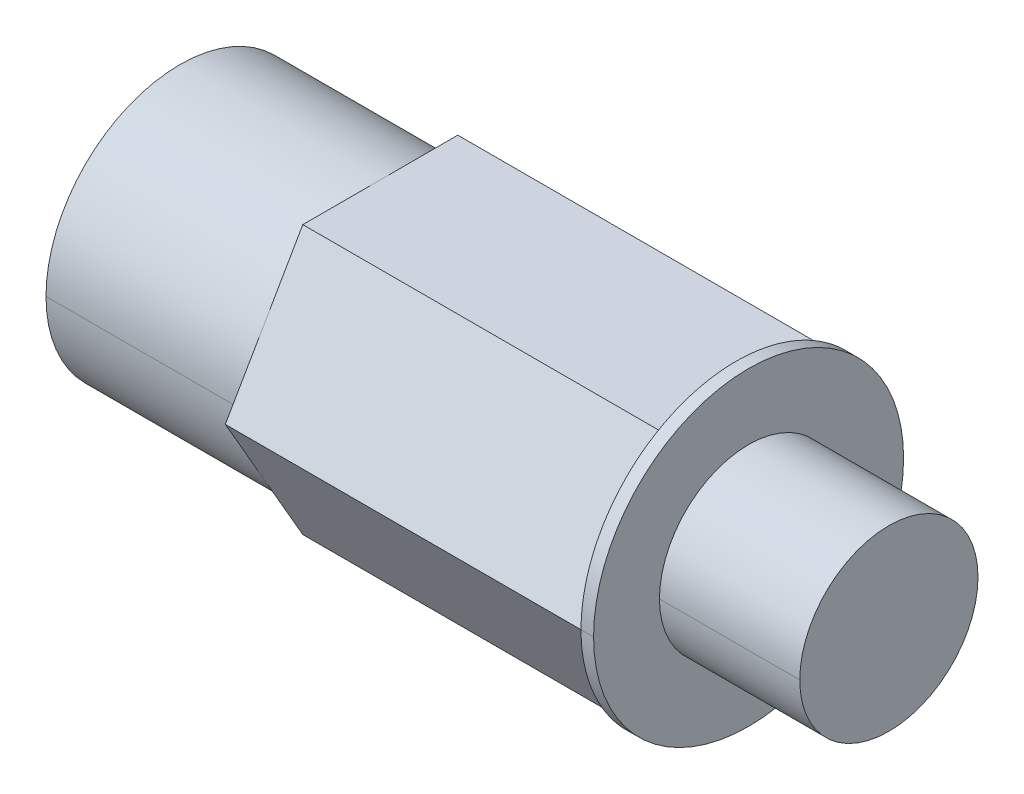
ISO-10303-21;
HEADER;
FILE_DESCRIPTION(('STEP AP214'),'2;1');
FILE_NAME('part.step','',(''),(''),'','','');
FILE_SCHEMA(('AUTOMOTIVE_DESIGN { 1 0 10303 214 1 1 1 1 }'));
ENDSEC;
DATA;
#1=APPLICATION_CONTEXT('core data for automotive mechanical design processes');
#2=APPLICATION_PROTOCOL_DEFINITION('international standard','automotive_design',2000,#1);
#3=PRODUCT_CONTEXT('',#1,'mechanical');
#4=PRODUCT('Part','Part','',(#3));
#5=PRODUCT_RELATED_PRODUCT_CATEGORY('part','',(#4));
#6=PRODUCT_DEFINITION_FORMATION('','',#4);
#7=PRODUCT_DEFINITION_CONTEXT('part definition',#1,'design');
#8=PRODUCT_DEFINITION('design','',#6,#7);
#9=PRODUCT_DEFINITION_SHAPE('','',#8);
#10=(LENGTH_UNIT() NAMED_UNIT(*) SI_UNIT(.MILLI.,.METRE.));
#11=(NAMED_UNIT(*) PLANE_ANGLE_UNIT() SI_UNIT($,.RADIAN.));
#12=(NAMED_UNIT(*) SI_UNIT($,.STERADIAN.) SOLID_ANGLE_UNIT());
#13=UNCERTAINTY_MEASURE_WITH_UNIT(LENGTH_MEASURE(1.E-05),#10,'distance_accuracy_value','');
#14=(GEOMETRIC_REPRESENTATION_CONTEXT(3) GLOBAL_UNCERTAINTY_ASSIGNED_CONTEXT((#13)) GLOBAL_UNIT_ASSIGNED_CONTEXT((#10,
#11,#12)) REPRESENTATION_CONTEXT('',''));
#15=CARTESIAN_POINT('',(0.,0.,0.));
#16=DIRECTION('',(0.,0.,1.));
#17=DIRECTION('',(1.,0.,0.));
#18=AXIS2_PLACEMENT_3D('',#15,#16,#17);
#19=CARTESIAN_POINT('',(11.7348,0.,0.));
#20=DIRECTION('',(1.,0.,0.));
#21=DIRECTION('',(0.,1.,0.));
#22=AXIS2_PLACEMENT_3D('',#19,#20,#21);
#23=PLANE('',#22);
#24=CARTESIAN_POINT('',(11.7348,0.,0.));
#25=DIRECTION('',(1.,0.,0.));
#26=DIRECTION('',(0.,0.,-1.));
#27=AXIS2_PLACEMENT_3D('',#24,#25,#26);
#28=CIRCLE('',#27,3.1623);
#29=CARTESIAN_POINT('',(11.7348,0.,3.1623));
#30=VERTEX_POINT('',#29);
#31=CARTESIAN_POINT('',(11.7348,0.,-3.1623));
#32=VERTEX_POINT('',#31);
#33=EDGE_CURVE('E11',#30,#32,#28,.T.);
#34=ORIENTED_EDGE('',*,*,#33,.T.);
#35=CARTESIAN_POINT('',(11.7348,0.,0.));
#36=DIRECTION('',(1.,0.,0.));
#37=DIRECTION('',(0.,0.,-1.));
#38=AXIS2_PLACEMENT_3D('',#35,#36,#37);
#39=CIRCLE('',#38,3.1623);
#40=EDGE_CURVE('E273',#32,#30,#39,.T.);
#41=ORIENTED_EDGE('',*,*,#40,.T.);
#42=EDGE_LOOP('',(#34,#41));
#43=FACE_BOUND('',#42,.T.);
#44=ADVANCED_FACE('F16',(#43),#23,.T.);
#45=CARTESIAN_POINT('',(11.7348,0.,0.));
#46=DIRECTION('',(-1.,0.,0.));
#47=DIRECTION('',(0.,0.,1.));
#48=AXIS2_PLACEMENT_3D('',#45,#46,#47);
#49=CYLINDRICAL_SURFACE('',#48,3.1623);
#50=DIRECTION('',(-1.,0.,0.));
#51=VECTOR('',#50,1.);
#52=CARTESIAN_POINT('',(11.7348,0.,-3.1623));
#53=LINE('',#52,#51);
#54=CARTESIAN_POINT('',(6.7564,0.,-3.1623));
#55=VERTEX_POINT('',#54);
#56=EDGE_CURVE('E270',#32,#55,#53,.T.);
#57=ORIENTED_EDGE('',*,*,#56,.F.);
#58=ORIENTED_EDGE('',*,*,#33,.F.);
#59=DIRECTION('',(-1.,0.,0.));
#60=VECTOR('',#59,1.);
#61=CARTESIAN_POINT('',(11.7348,0.,3.1623));
#62=LINE('',#61,#60);
#63=CARTESIAN_POINT('',(6.7564,0.,3.1623));
#64=VERTEX_POINT('',#63);
#65=EDGE_CURVE('E188',#30,#64,#62,.T.);
#66=ORIENTED_EDGE('',*,*,#65,.T.);
#67=CARTESIAN_POINT('',(6.7564,0.,0.));
#68=DIRECTION('',(1.,0.,0.));
#69=DIRECTION('',(0.,0.,-1.));
#70=AXIS2_PLACEMENT_3D('',#67,#68,#69);
#71=CIRCLE('',#70,3.1623);
#72=EDGE_CURVE('E27',#64,#55,#71,.T.);
#73=ORIENTED_EDGE('',*,*,#72,.T.);
#74=EDGE_LOOP('',(#57,#58,#66,#73));
#75=FACE_BOUND('',#74,.T.);
#76=ADVANCED_FACE('F339',(#75),#49,.T.);
#77=CARTESIAN_POINT('',(6.7564,0.,0.));
#78=DIRECTION('',(1.,0.,0.));
#79=DIRECTION('',(0.,1.,0.));
#80=AXIS2_PLACEMENT_3D('',#77,#78,#79);
#81=PLANE('',#80);
#82=ORIENTED_EDGE('',*,*,#72,.F.);
#83=CARTESIAN_POINT('',(6.7564,0.,0.));
#84=DIRECTION('',(1.,0.,0.));
#85=DIRECTION('',(0.,0.,-1.));
#86=AXIS2_PLACEMENT_3D('',#83,#84,#85);
#87=CIRCLE('',#86,3.1623);
#88=EDGE_CURVE('E196',#55,#64,#87,.T.);
#89=ORIENTED_EDGE('',*,*,#88,.F.);
#90=EDGE_LOOP('',(#82,#89));
#91=FACE_BOUND('',#90,.T.);
#92=CARTESIAN_POINT('',(6.7564,0.,0.));
#93=DIRECTION('',(1.,0.,0.));
#94=DIRECTION('',(0.,0.,-1.));
#95=AXIS2_PLACEMENT_3D('',#92,#93,#94);
#96=CIRCLE('',#95,5.5);
#97=CARTESIAN_POINT('',(6.7564,0.,5.5));
#98=VERTEX_POINT('',#97);
#99=CARTESIAN_POINT('',(6.7564,0.,-5.5));
#100=VERTEX_POINT('',#99);
#101=EDGE_CURVE('E167',#98,#100,#96,.T.);
#102=ORIENTED_EDGE('',*,*,#101,.T.);
#103=CARTESIAN_POINT('',(6.7564,0.,0.));
#104=DIRECTION('',(1.,0.,0.));
#105=DIRECTION('',(0.,0.,-1.));
#106=AXIS2_PLACEMENT_3D('',#103,#104,#105);
#107=CIRCLE('',#106,5.5);
#108=EDGE_CURVE('E181',#100,#98,#107,.T.);
#109=ORIENTED_EDGE('',*,*,#108,.T.);
#110=EDGE_LOOP('',(#102,#109));
#111=FACE_BOUND('',#110,.T.);
#112=ADVANCED_FACE('F186',(#91,#111),#81,.T.);
#113=CARTESIAN_POINT('',(6.7564,0.,0.));
#114=DIRECTION('',(-1.,0.,0.));
#115=DIRECTION('',(0.,0.,1.));
#116=AXIS2_PLACEMENT_3D('',#113,#114,#115);
#117=CYLINDRICAL_SURFACE('',#116,5.5);
#118=DIRECTION('',(-1.,0.,0.));
#119=VECTOR('',#118,1.);
#120=CARTESIAN_POINT('',(6.7564,0.,-5.5));
#121=LINE('',#120,#119);
#122=CARTESIAN_POINT('',(6.3119,0.,-5.5));
#123=VERTEX_POINT('',#122);
#124=EDGE_CURVE('E173',#100,#123,#121,.T.);
#125=ORIENTED_EDGE('',*,*,#124,.F.);
#126=ORIENTED_EDGE('',*,*,#101,.F.);
#127=DIRECTION('',(-1.,0.,0.));
#128=VECTOR('',#127,1.);
#129=CARTESIAN_POINT('',(6.7564,0.,5.5));
#130=LINE('',#129,#128);
#131=CARTESIAN_POINT('',(6.3119,0.,5.5));
#132=VERTEX_POINT('',#131);
#133=EDGE_CURVE('E170',#98,#132,#130,.T.);
#134=ORIENTED_EDGE('',*,*,#133,.T.);
#135=CARTESIAN_POINT('',(6.3119,0.,0.));
#136=DIRECTION('',(1.,0.,0.));
#137=DIRECTION('',(0.,0.,-1.));
#138=AXIS2_PLACEMENT_3D('',#135,#136,#137);
#139=CIRCLE('',#138,5.5);
#140=EDGE_CURVE('E162',#132,#123,#139,.T.);
#141=ORIENTED_EDGE('',*,*,#140,.T.);
#142=EDGE_LOOP('',(#125,#126,#134,#141));
#143=FACE_BOUND('',#142,.T.);
#144=ADVANCED_FACE('F169',(#143),#117,.T.);
#145=CARTESIAN_POINT('',(6.3119,0.,0.));
#146=DIRECTION('',(1.,0.,0.));
#147=DIRECTION('',(0.,1.,0.));
#148=AXIS2_PLACEMENT_3D('',#145,#146,#147);
#149=PLANE('',#148);
#150=DIRECTION('',(0.,0.,-1.));
#151=VECTOR('',#150,1.);
#152=CARTESIAN_POINT('',(6.3119,-4.7625,2.74963065701558));
#153=LINE('',#152,#151);
#154=CARTESIAN_POINT('',(6.3119,-4.7625,2.74963065701558));
#155=VERTEX_POINT('',#154);
#156=CARTESIAN_POINT('',(6.3119,-4.7625,-2.7496306570156));
#157=VERTEX_POINT('',#156);
#158=EDGE_CURVE('E42',#155,#157,#153,.T.);
#159=ORIENTED_EDGE('',*,*,#158,.T.);
#160=DIRECTION('',(0.,0.866025403784439,-0.5));
#161=VECTOR('',#160,1.);
#162=CARTESIAN_POINT('',(6.3119,-4.7625,-2.7496306570156));
#163=LINE('',#162,#161);
#164=CARTESIAN_POINT('',(6.3119,0.,-5.49926131403118));
#165=VERTEX_POINT('',#164);
#166=EDGE_CURVE('E206',#157,#165,#163,.T.);
#167=ORIENTED_EDGE('',*,*,#166,.T.);
#168=DIRECTION('',(0.,0.866025403784439,0.5));
#169=VECTOR('',#168,1.);
#170=CARTESIAN_POINT('',(6.3119,0.,-5.49926131403118));
#171=LINE('',#170,#169);
#172=CARTESIAN_POINT('',(6.3119,4.7625,-2.74963065701559));
#173=VERTEX_POINT('',#172);
#174=EDGE_CURVE('E108',#165,#173,#171,.T.);
#175=ORIENTED_EDGE('',*,*,#174,.T.);
#176=DIRECTION('',(0.,0.,1.));
#177=VECTOR('',#176,1.);
#178=CARTESIAN_POINT('',(6.3119,4.7625,-2.74963065701559));
#179=LINE('',#178,#177);
#180=CARTESIAN_POINT('',(6.3119,4.7625,2.74963065701559));
#181=VERTEX_POINT('',#180);
#182=EDGE_CURVE('E242',#173,#181,#179,.T.);
#183=ORIENTED_EDGE('',*,*,#182,.T.);
#184=DIRECTION('',(0.,-0.866025403784439,0.5));
#185=VECTOR('',#184,1.);
#186=CARTESIAN_POINT('',(6.3119,4.7625,2.74963065701559));
#187=LINE('',#186,#185);
#188=CARTESIAN_POINT('',(6.3119,0.,5.49926131403118));
#189=VERTEX_POINT('',#188);
#190=EDGE_CURVE('E266',#181,#189,#187,.T.);
#191=ORIENTED_EDGE('',*,*,#190,.T.);
#192=DIRECTION('',(0.,-0.866025403784438,-0.5));
#193=VECTOR('',#192,1.);
#194=CARTESIAN_POINT('',(6.3119,0.,5.49926131403118));
#195=LINE('',#194,#193);
#196=EDGE_CURVE('E223',#189,#155,#195,.T.);
#197=ORIENTED_EDGE('',*,*,#196,.T.);
#198=EDGE_LOOP('',(#159,#167,#175,#183,#191,#197));
#199=FACE_BOUND('',#198,.T.);
#200=ORIENTED_EDGE('',*,*,#140,.F.);
#201=CARTESIAN_POINT('',(6.3119,0.,0.));
#202=DIRECTION('',(1.,0.,0.));
#203=DIRECTION('',(0.,0.,-1.));
#204=AXIS2_PLACEMENT_3D('',#201,#202,#203);
#205=CIRCLE('',#204,5.5);
#206=EDGE_CURVE('E182',#123,#132,#205,.T.);
#207=ORIENTED_EDGE('',*,*,#206,.F.);
#208=EDGE_LOOP('',(#200,#207));
#209=FACE_BOUND('',#208,.T.);
#210=ADVANCED_FACE('F345',(#199,#209),#149,.F.);
#211=CARTESIAN_POINT('',(-13.4239,0.,0.));
#212=DIRECTION('',(-1.,0.,0.));
#213=DIRECTION('',(0.,0.,1.));
#214=AXIS2_PLACEMENT_3D('',#211,#212,#213);
#215=PLANE('',#214);
#216=CARTESIAN_POINT('',(-13.4239,0.,0.));
#217=DIRECTION('',(-1.,0.,0.));
#218=DIRECTION('',(0.,0.,1.));
#219=AXIS2_PLACEMENT_3D('',#216,#217,#218);
#220=CIRCLE('',#219,4.7498);
#221=CARTESIAN_POINT('',(-13.4239,0.,-4.7498));
#222=VERTEX_POINT('',#221);
#223=CARTESIAN_POINT('',(-13.4239,0.,4.7498));
#224=VERTEX_POINT('',#223);
#225=EDGE_CURVE('E142',#222,#224,#220,.T.);
#226=ORIENTED_EDGE('',*,*,#225,.T.);
#227=CARTESIAN_POINT('',(-13.4239,0.,0.));
#228=DIRECTION('',(-1.,0.,0.));
#229=DIRECTION('',(0.,0.,1.));
#230=AXIS2_PLACEMENT_3D('',#227,#228,#229);
#231=CIRCLE('',#230,4.7498);
#232=EDGE_CURVE('E184',#224,#222,#231,.T.);
#233=ORIENTED_EDGE('',*,*,#232,.T.);
#234=EDGE_LOOP('',(#226,#233));
#235=FACE_BOUND('',#234,.T.);
#236=ADVANCED_FACE('F348',(#235),#215,.T.);
#237=CARTESIAN_POINT('',(-13.4239,0.,0.));
#238=DIRECTION('',(1.,0.,0.));
#239=DIRECTION('',(0.,0.,-1.));
#240=AXIS2_PLACEMENT_3D('',#237,#238,#239);
#241=CYLINDRICAL_SURFACE('',#240,4.7498);
#242=DIRECTION('',(1.,0.,0.));
#243=VECTOR('',#242,1.);
#244=CARTESIAN_POINT('',(-13.4239,0.,4.7498));
#245=LINE('',#244,#243);
#246=CARTESIAN_POINT('',(-6.3119,0.,4.7498));
#247=VERTEX_POINT('',#246);
#248=EDGE_CURVE('E202',#224,#247,#245,.T.);
#249=ORIENTED_EDGE('',*,*,#248,.F.);
#250=ORIENTED_EDGE('',*,*,#225,.F.);
#251=DIRECTION('',(1.,0.,0.));
#252=VECTOR('',#251,1.);
#253=CARTESIAN_POINT('',(-13.4239,0.,-4.7498));
#254=LINE('',#253,#252);
#255=CARTESIAN_POINT('',(-6.3119,0.,-4.7498));
#256=VERTEX_POINT('',#255);
#257=EDGE_CURVE('E257',#222,#256,#254,.T.);
#258=ORIENTED_EDGE('',*,*,#257,.T.);
#259=CARTESIAN_POINT('',(-6.3119,0.,0.));
#260=DIRECTION('',(-1.,0.,0.));
#261=DIRECTION('',(0.,0.,1.));
#262=AXIS2_PLACEMENT_3D('',#259,#260,#261);
#263=CIRCLE('',#262,4.7498);
#264=EDGE_CURVE('E212',#256,#247,#263,.T.);
#265=ORIENTED_EDGE('',*,*,#264,.T.);
#266=EDGE_LOOP('',(#249,#250,#258,#265));
#267=FACE_BOUND('',#266,.T.);
#268=ADVANCED_FACE('F334',(#267),#241,.T.);
#269=CARTESIAN_POINT('',(-6.3119,0.,0.));
#270=DIRECTION('',(1.,0.,0.));
#271=DIRECTION('',(0.,1.,0.));
#272=AXIS2_PLACEMENT_3D('',#269,#270,#271);
#273=PLANE('',#272);
#274=ORIENTED_EDGE('',*,*,#264,.F.);
#275=CARTESIAN_POINT('',(-6.3119,0.,0.));
#276=DIRECTION('',(-1.,0.,0.));
#277=DIRECTION('',(0.,0.,1.));
#278=AXIS2_PLACEMENT_3D('',#275,#276,#277);
#279=CIRCLE('',#278,4.7498);
#280=EDGE_CURVE('E267',#247,#256,#279,.T.);
#281=ORIENTED_EDGE('',*,*,#280,.F.);
#282=EDGE_LOOP('',(#274,#281));
#283=FACE_BOUND('',#282,.T.);
#284=DIRECTION('',(0.,0.866025403784439,-0.5));
#285=VECTOR('',#284,1.);
#286=CARTESIAN_POINT('',(-6.3119,-4.7625,-2.7496306570156));
#287=LINE('',#286,#285);
#288=CARTESIAN_POINT('',(-6.3119,-4.7625,-2.7496306570156));
#289=VERTEX_POINT('',#288);
#290=CARTESIAN_POINT('',(-6.3119,0.,-5.49926131403118));
#291=VERTEX_POINT('',#290);
#292=EDGE_CURVE('E207',#289,#291,#287,.T.);
#293=ORIENTED_EDGE('',*,*,#292,.F.);
#294=DIRECTION('',(0.,0.,-1.));
#295=VECTOR('',#294,1.);
#296=CARTESIAN_POINT('',(-6.3119,-4.7625,2.74963065701558));
#297=LINE('',#296,#295);
#298=CARTESIAN_POINT('',(-6.3119,-4.7625,2.74963065701558));
#299=VERTEX_POINT('',#298);
#300=EDGE_CURVE('E218',#299,#289,#297,.T.);
#301=ORIENTED_EDGE('',*,*,#300,.F.);
#302=DIRECTION('',(0.,-0.866025403784438,-0.5));
#303=VECTOR('',#302,1.);
#304=CARTESIAN_POINT('',(-6.3119,0.,5.49926131403118));
#305=LINE('',#304,#303);
#306=CARTESIAN_POINT('',(-6.3119,0.,5.49926131403118));
#307=VERTEX_POINT('',#306);
#308=EDGE_CURVE('E236',#307,#299,#305,.T.);
#309=ORIENTED_EDGE('',*,*,#308,.F.);
#310=DIRECTION('',(0.,-0.866025403784439,0.5));
#311=VECTOR('',#310,1.);
#312=CARTESIAN_POINT('',(-6.3119,4.7625,2.74963065701559));
#313=LINE('',#312,#311);
#314=CARTESIAN_POINT('',(-6.3119,4.7625,2.74963065701559));
#315=VERTEX_POINT('',#314);
#316=EDGE_CURVE('E246',#315,#307,#313,.T.);
#317=ORIENTED_EDGE('',*,*,#316,.F.);
#318=DIRECTION('',(0.,0.,1.));
#319=VECTOR('',#318,1.);
#320=CARTESIAN_POINT('',(-6.3119,4.7625,-2.74963065701559));
#321=LINE('',#320,#319);
#322=CARTESIAN_POINT('',(-6.3119,4.7625,-2.74963065701559));
#323=VERTEX_POINT('',#322);
#324=EDGE_CURVE('E20',#323,#315,#321,.T.);
#325=ORIENTED_EDGE('',*,*,#324,.F.);
#326=DIRECTION('',(0.,0.866025403784439,0.5));
#327=VECTOR('',#326,1.);
#328=CARTESIAN_POINT('',(-6.3119,0.,-5.49926131403118));
#329=LINE('',#328,#327);
#330=EDGE_CURVE('E228',#291,#323,#329,.T.);
#331=ORIENTED_EDGE('',*,*,#330,.F.);
#332=EDGE_LOOP('',(#293,#301,#309,#317,#325,#331));
#333=FACE_BOUND('',#332,.T.);
#334=ADVANCED_FACE('F323',(#283,#333),#273,.F.);
#335=CARTESIAN_POINT('',(6.3119,-4.7625,2.74963065701558));
#336=DIRECTION('',(0.,1.,0.));
#337=DIRECTION('',(0.,0.,-1.));
#338=AXIS2_PLACEMENT_3D('',#335,#336,#337);
#339=PLANE('',#338);
#340=ORIENTED_EDGE('',*,*,#300,.T.);
#341=DIRECTION('',(-1.,0.,0.));
#342=VECTOR('',#341,1.);
#343=CARTESIAN_POINT('',(6.3119,-4.7625,-2.7496306570156));
#344=LINE('',#343,#342);
#345=EDGE_CURVE('E210',#157,#289,#344,.T.);
#346=ORIENTED_EDGE('',*,*,#345,.F.);
#347=ORIENTED_EDGE('',*,*,#158,.F.);
#348=DIRECTION('',(-1.,0.,0.));
#349=VECTOR('',#348,1.);
#350=CARTESIAN_POINT('',(6.3119,-4.7625,2.74963065701558));
#351=LINE('',#350,#349);
#352=EDGE_CURVE('E233',#155,#299,#351,.T.);
#353=ORIENTED_EDGE('',*,*,#352,.T.);
#354=EDGE_LOOP('',(#340,#346,#347,#353));
#355=FACE_BOUND('',#354,.T.);
#356=ADVANCED_FACE('F324',(#355),#339,.F.);
#357=CARTESIAN_POINT('',(6.3119,0.,5.49926131403118));
#358=DIRECTION('',(0.,0.5,-0.866025403784438));
#359=DIRECTION('',(-1.,0.,0.));
#360=AXIS2_PLACEMENT_3D('',#357,#358,#359);
#361=PLANE('',#360);
#362=ORIENTED_EDGE('',*,*,#308,.T.);
#363=ORIENTED_EDGE('',*,*,#352,.F.);
#364=ORIENTED_EDGE('',*,*,#196,.F.);
#365=DIRECTION('',(-1.,0.,0.));
#366=VECTOR('',#365,1.);
#367=CARTESIAN_POINT('',(6.3119,0.,5.49926131403118));
#368=LINE('',#367,#366);
#369=EDGE_CURVE('E250',#189,#307,#368,.T.);
#370=ORIENTED_EDGE('',*,*,#369,.T.);
#371=EDGE_LOOP('',(#362,#363,#364,#370));
#372=FACE_BOUND('',#371,.T.);
#373=ADVANCED_FACE('F318',(#372),#361,.F.);
#374=CARTESIAN_POINT('',(6.3119,4.7625,2.74963065701559));
#375=DIRECTION('',(0.,-0.5,-0.866025403784439));
#376=DIRECTION('',(0.,-0.866025403784439,0.5));
#377=AXIS2_PLACEMENT_3D('',#374,#375,#376);
#378=PLANE('',#377);
#379=ORIENTED_EDGE('',*,*,#316,.T.);
#380=ORIENTED_EDGE('',*,*,#369,.F.);
#381=ORIENTED_EDGE('',*,*,#190,.F.);
#382=DIRECTION('',(-1.,0.,0.));
#383=VECTOR('',#382,1.);
#384=CARTESIAN_POINT('',(6.3119,4.7625,2.74963065701559));
#385=LINE('',#384,#383);
#386=EDGE_CURVE('E247',#181,#315,#385,.T.);
#387=ORIENTED_EDGE('',*,*,#386,.T.);
#388=EDGE_LOOP('',(#379,#380,#381,#387));
#389=FACE_BOUND('',#388,.T.);
#390=ADVANCED_FACE('F332',(#389),#378,.F.);
#391=CARTESIAN_POINT('',(6.3119,4.7625,-2.74963065701559));
#392=DIRECTION('',(0.,-1.,0.));
#393=DIRECTION('',(0.,0.,-1.));
#394=AXIS2_PLACEMENT_3D('',#391,#392,#393);
#395=PLANE('',#394);
#396=ORIENTED_EDGE('',*,*,#324,.T.);
#397=ORIENTED_EDGE('',*,*,#386,.F.);
#398=ORIENTED_EDGE('',*,*,#182,.F.);
#399=DIRECTION('',(-1.,0.,0.));
#400=VECTOR('',#399,1.);
#401=CARTESIAN_POINT('',(6.3119,4.7625,-2.74963065701559));
#402=LINE('',#401,#400);
#403=EDGE_CURVE('E232',#173,#323,#402,.T.);
#404=ORIENTED_EDGE('',*,*,#403,.T.);
#405=EDGE_LOOP('',(#396,#397,#398,#404));
#406=FACE_BOUND('',#405,.T.);
#407=ADVANCED_FACE('F18',(#406),#395,.F.);
#408=CARTESIAN_POINT('',(6.3119,0.,-5.49926131403118));
#409=DIRECTION('',(0.,-0.5,0.866025403784439));
#410=DIRECTION('',(-1.,0.,0.));
#411=AXIS2_PLACEMENT_3D('',#408,#409,#410);
#412=PLANE('',#411);
#413=ORIENTED_EDGE('',*,*,#330,.T.);
#414=ORIENTED_EDGE('',*,*,#403,.F.);
#415=ORIENTED_EDGE('',*,*,#174,.F.);
#416=DIRECTION('',(-1.,0.,0.));
#417=VECTOR('',#416,1.);
#418=CARTESIAN_POINT('',(6.3119,0.,-5.49926131403118));
#419=LINE('',#418,#417);
#420=EDGE_CURVE('E203',#165,#291,#419,.T.);
#421=ORIENTED_EDGE('',*,*,#420,.T.);
#422=EDGE_LOOP('',(#413,#414,#415,#421));
#423=FACE_BOUND('',#422,.T.);
#424=ADVANCED_FACE('F349',(#423),#412,.F.);
#425=CARTESIAN_POINT('',(6.3119,-4.7625,-2.7496306570156));
#426=DIRECTION('',(0.,0.5,0.866025403784439));
#427=DIRECTION('',(1.,0.,0.));
#428=AXIS2_PLACEMENT_3D('',#425,#426,#427);
#429=PLANE('',#428);
#430=ORIENTED_EDGE('',*,*,#292,.T.);
#431=ORIENTED_EDGE('',*,*,#420,.F.);
#432=ORIENTED_EDGE('',*,*,#166,.F.);
#433=ORIENTED_EDGE('',*,*,#345,.T.);
#434=EDGE_LOOP('',(#430,#431,#432,#433));
#435=FACE_BOUND('',#434,.T.);
#436=ADVANCED_FACE('F351',(#435),#429,.F.);
#437=CARTESIAN_POINT('',(-13.4239,0.,0.));
#438=DIRECTION('',(1.,0.,0.));
#439=DIRECTION('',(0.,0.,-1.));
#440=AXIS2_PLACEMENT_3D('',#437,#438,#439);
#441=CYLINDRICAL_SURFACE('',#440,4.7498);
#442=ORIENTED_EDGE('',*,*,#232,.F.);
#443=ORIENTED_EDGE('',*,*,#248,.T.);
#444=ORIENTED_EDGE('',*,*,#280,.T.);
#445=ORIENTED_EDGE('',*,*,#257,.F.);
#446=EDGE_LOOP('',(#442,#443,#444,#445));
#447=FACE_BOUND('',#446,.T.);
#448=ADVANCED_FACE('F356',(#447),#441,.T.);
#449=CARTESIAN_POINT('',(6.7564,0.,0.));
#450=DIRECTION('',(-1.,0.,0.));
#451=DIRECTION('',(0.,0.,1.));
#452=AXIS2_PLACEMENT_3D('',#449,#450,#451);
#453=CYLINDRICAL_SURFACE('',#452,5.5);
#454=ORIENTED_EDGE('',*,*,#108,.F.);
#455=ORIENTED_EDGE('',*,*,#124,.T.);
#456=ORIENTED_EDGE('',*,*,#206,.T.);
#457=ORIENTED_EDGE('',*,*,#133,.F.);
#458=EDGE_LOOP('',(#454,#455,#456,#457));
#459=FACE_BOUND('',#458,.T.);
#460=ADVANCED_FACE('F180',(#459),#453,.T.);
#461=CARTESIAN_POINT('',(11.7348,0.,0.));
#462=DIRECTION('',(-1.,0.,0.));
#463=DIRECTION('',(0.,0.,1.));
#464=AXIS2_PLACEMENT_3D('',#461,#462,#463);
#465=CYLINDRICAL_SURFACE('',#464,3.1623);
#466=ORIENTED_EDGE('',*,*,#40,.F.);
#467=ORIENTED_EDGE('',*,*,#56,.T.);
#468=ORIENTED_EDGE('',*,*,#88,.T.);
#469=ORIENTED_EDGE('',*,*,#65,.F.);
#470=EDGE_LOOP('',(#466,#467,#468,#469));
#471=FACE_BOUND('',#470,.T.);
#472=ADVANCED_FACE('F543',(#471),#465,.T.);
#473=CLOSED_SHELL('',(#44,#76,#112,#144,#210,#236,#268,#334,#356,#373,#390,#407,#424,#436,#448,
#460,#472));
#474=MANIFOLD_SOLID_BREP('B1',#473);
#475=ADVANCED_BREP_SHAPE_REPRESENTATION('',(#18,#474),#14);
#476=SHAPE_DEFINITION_REPRESENTATION(#9,#475);
ENDSEC;
END-ISO-10303-21;
